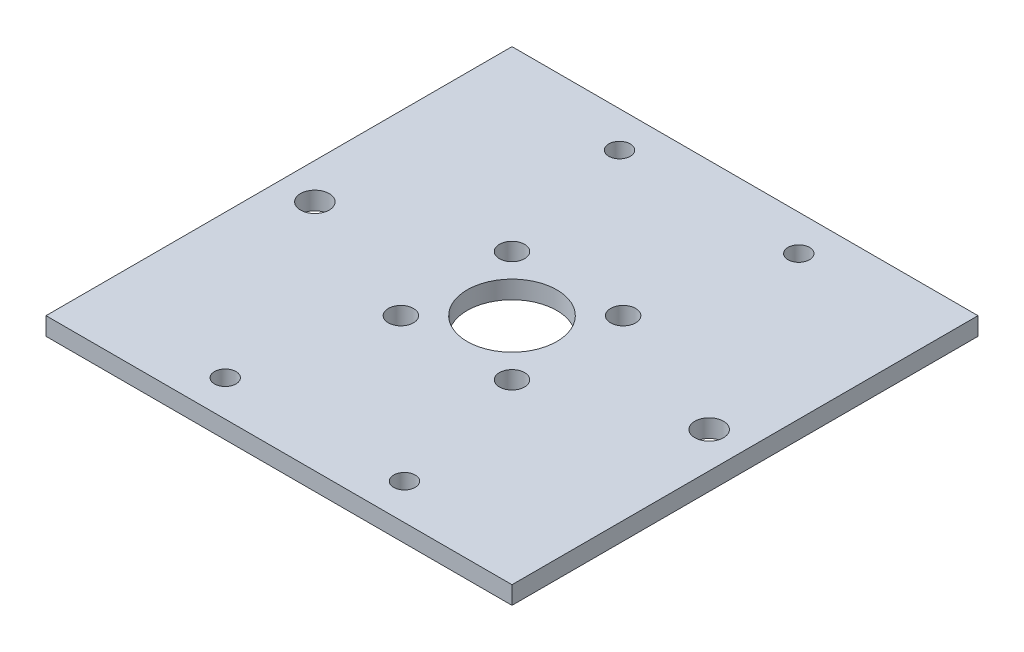
ISO-10303-21;
HEADER;
FILE_DESCRIPTION(('STEP AP214'),'2;1');
FILE_NAME('part.step','',(''),(''),'','','');
FILE_SCHEMA(('AUTOMOTIVE_DESIGN { 1 0 10303 214 1 1 1 1 }'));
ENDSEC;
DATA;
#1=APPLICATION_CONTEXT('core data for automotive mechanical design processes');
#2=APPLICATION_PROTOCOL_DEFINITION('international standard','automotive_design',2000,#1);
#3=PRODUCT_CONTEXT('',#1,'mechanical');
#4=PRODUCT('Part','Part','',(#3));
#5=PRODUCT_RELATED_PRODUCT_CATEGORY('part','',(#4));
#6=PRODUCT_DEFINITION_FORMATION('','',#4);
#7=PRODUCT_DEFINITION_CONTEXT('part definition',#1,'design');
#8=PRODUCT_DEFINITION('design','',#6,#7);
#9=PRODUCT_DEFINITION_SHAPE('','',#8);
#10=(LENGTH_UNIT() NAMED_UNIT(*) SI_UNIT(.MILLI.,.METRE.));
#11=(NAMED_UNIT(*) PLANE_ANGLE_UNIT() SI_UNIT($,.RADIAN.));
#12=(NAMED_UNIT(*) SI_UNIT($,.STERADIAN.) SOLID_ANGLE_UNIT());
#13=UNCERTAINTY_MEASURE_WITH_UNIT(LENGTH_MEASURE(1.E-05),#10,'distance_accuracy_value','');
#14=(GEOMETRIC_REPRESENTATION_CONTEXT(3) GLOBAL_UNCERTAINTY_ASSIGNED_CONTEXT((#13)) GLOBAL_UNIT_ASSIGNED_CONTEXT((#10,
#11,#12)) REPRESENTATION_CONTEXT('',''));
#15=CARTESIAN_POINT('',(0.,0.,0.));
#16=DIRECTION('',(0.,0.,1.));
#17=DIRECTION('',(1.,0.,0.));
#18=AXIS2_PLACEMENT_3D('',#15,#16,#17);
#19=CARTESIAN_POINT('',(65.,5.,0.));
#20=DIRECTION('',(1.,0.,0.));
#21=DIRECTION('',(0.,0.,-1.));
#22=AXIS2_PLACEMENT_3D('',#19,#20,#21);
#23=PLANE('',#22);
#24=DIRECTION('',(0.,0.,1.));
#25=VECTOR('',#24,1.);
#26=CARTESIAN_POINT('',(65.,0.,0.));
#27=LINE('',#26,#25);
#28=CARTESIAN_POINT('',(65.,0.,-65.));
#29=VERTEX_POINT('',#28);
#30=CARTESIAN_POINT('',(65.,0.,65.));
#31=VERTEX_POINT('',#30);
#32=EDGE_CURVE('E130',#29,#31,#27,.T.);
#33=ORIENTED_EDGE('',*,*,#32,.F.);
#34=DIRECTION('',(0.,-1.,0.));
#35=VECTOR('',#34,1.);
#36=CARTESIAN_POINT('',(65.,5.,-65.));
#37=LINE('',#36,#35);
#38=CARTESIAN_POINT('',(65.,5.,-65.));
#39=VERTEX_POINT('',#38);
#40=EDGE_CURVE('E11',#39,#29,#37,.T.);
#41=ORIENTED_EDGE('',*,*,#40,.F.);
#42=DIRECTION('',(0.,0.,1.));
#43=VECTOR('',#42,1.);
#44=CARTESIAN_POINT('',(65.,5.,0.));
#45=LINE('',#44,#43);
#46=CARTESIAN_POINT('',(65.,5.,65.));
#47=VERTEX_POINT('',#46);
#48=EDGE_CURVE('E108',#39,#47,#45,.T.);
#49=ORIENTED_EDGE('',*,*,#48,.T.);
#50=DIRECTION('',(0.,-1.,0.));
#51=VECTOR('',#50,1.);
#52=CARTESIAN_POINT('',(65.,5.,65.));
#53=LINE('',#52,#51);
#54=EDGE_CURVE('E83',#47,#31,#53,.T.);
#55=ORIENTED_EDGE('',*,*,#54,.T.);
#56=EDGE_LOOP('',(#33,#41,#49,#55));
#57=FACE_BOUND('',#56,.T.);
#58=ADVANCED_FACE('F40',(#57),#23,.T.);
#59=CARTESIAN_POINT('',(0.,5.,-65.));
#60=DIRECTION('',(0.,0.,-1.));
#61=DIRECTION('',(-1.,0.,0.));
#62=AXIS2_PLACEMENT_3D('',#59,#60,#61);
#63=PLANE('',#62);
#64=DIRECTION('',(1.,0.,0.));
#65=VECTOR('',#64,1.);
#66=CARTESIAN_POINT('',(0.,0.,-65.));
#67=LINE('',#66,#65);
#68=CARTESIAN_POINT('',(-65.,0.,-65.));
#69=VERTEX_POINT('',#68);
#70=EDGE_CURVE('E95',#69,#29,#67,.T.);
#71=ORIENTED_EDGE('',*,*,#70,.F.);
#72=DIRECTION('',(0.,-1.,0.));
#73=VECTOR('',#72,1.);
#74=CARTESIAN_POINT('',(-65.,5.,-65.));
#75=LINE('',#74,#73);
#76=CARTESIAN_POINT('',(-65.,5.,-65.));
#77=VERTEX_POINT('',#76);
#78=EDGE_CURVE('E51',#77,#69,#75,.T.);
#79=ORIENTED_EDGE('',*,*,#78,.F.);
#80=DIRECTION('',(1.,0.,0.));
#81=VECTOR('',#80,1.);
#82=CARTESIAN_POINT('',(0.,5.,-65.));
#83=LINE('',#82,#81);
#84=EDGE_CURVE('E93',#77,#39,#83,.T.);
#85=ORIENTED_EDGE('',*,*,#84,.T.);
#86=ORIENTED_EDGE('',*,*,#40,.T.);
#87=EDGE_LOOP('',(#71,#79,#85,#86));
#88=FACE_BOUND('',#87,.T.);
#89=ADVANCED_FACE('F91',(#88),#63,.T.);
#90=CARTESIAN_POINT('',(-65.,5.,0.));
#91=DIRECTION('',(1.,0.,0.));
#92=DIRECTION('',(0.,0.,-1.));
#93=AXIS2_PLACEMENT_3D('',#90,#91,#92);
#94=PLANE('',#93);
#95=DIRECTION('',(0.,0.,1.));
#96=VECTOR('',#95,1.);
#97=CARTESIAN_POINT('',(-65.,0.,0.));
#98=LINE('',#97,#96);
#99=CARTESIAN_POINT('',(-65.,0.,65.));
#100=VERTEX_POINT('',#99);
#101=EDGE_CURVE('E135',#69,#100,#98,.T.);
#102=ORIENTED_EDGE('',*,*,#101,.T.);
#103=DIRECTION('',(0.,-1.,0.));
#104=VECTOR('',#103,1.);
#105=CARTESIAN_POINT('',(-65.,5.,65.));
#106=LINE('',#105,#104);
#107=CARTESIAN_POINT('',(-65.,5.,65.));
#108=VERTEX_POINT('',#107);
#109=EDGE_CURVE('E99',#108,#100,#106,.T.);
#110=ORIENTED_EDGE('',*,*,#109,.F.);
#111=DIRECTION('',(0.,0.,1.));
#112=VECTOR('',#111,1.);
#113=CARTESIAN_POINT('',(-65.,5.,0.));
#114=LINE('',#113,#112);
#115=EDGE_CURVE('E102',#77,#108,#114,.T.);
#116=ORIENTED_EDGE('',*,*,#115,.F.);
#117=ORIENTED_EDGE('',*,*,#78,.T.);
#118=EDGE_LOOP('',(#102,#110,#116,#117));
#119=FACE_BOUND('',#118,.T.);
#120=ADVANCED_FACE('F103',(#119),#94,.F.);
#121=CARTESIAN_POINT('',(-55.,5.,0.));
#122=DIRECTION('',(0.,-1.,0.));
#123=DIRECTION('',(0.,0.,-1.));
#124=AXIS2_PLACEMENT_3D('',#121,#122,#123);
#125=CYLINDRICAL_SURFACE('',#124,4.00000000000001);
#126=CARTESIAN_POINT('',(-55.,5.,0.));
#127=DIRECTION('',(0.,1.,0.));
#128=DIRECTION('',(0.,0.,1.));
#129=AXIS2_PLACEMENT_3D('',#126,#127,#128);
#130=CIRCLE('',#129,4.00000000000001);
#131=CARTESIAN_POINT('',(-55.,5.,4.00000000000001));
#132=VERTEX_POINT('',#131);
#133=EDGE_CURVE('E118',#132,#132,#130,.T.);
#134=ORIENTED_EDGE('',*,*,#133,.T.);
#135=EDGE_LOOP('',(#134));
#136=FACE_BOUND('',#135,.T.);
#137=CARTESIAN_POINT('',(-55.,0.,0.));
#138=DIRECTION('',(0.,1.,0.));
#139=DIRECTION('',(0.,0.,1.));
#140=AXIS2_PLACEMENT_3D('',#137,#138,#139);
#141=CIRCLE('',#140,4.00000000000001);
#142=CARTESIAN_POINT('',(-55.,0.,4.00000000000001));
#143=VERTEX_POINT('',#142);
#144=EDGE_CURVE('E140',#143,#143,#141,.T.);
#145=ORIENTED_EDGE('',*,*,#144,.F.);
#146=EDGE_LOOP('',(#145));
#147=FACE_BOUND('',#146,.T.);
#148=ADVANCED_FACE('F197',(#136,#147),#125,.F.);
#149=CARTESIAN_POINT('',(0.,5.,65.));
#150=DIRECTION('',(0.,0.,-1.));
#151=DIRECTION('',(-1.,0.,0.));
#152=AXIS2_PLACEMENT_3D('',#149,#150,#151);
#153=PLANE('',#152);
#154=DIRECTION('',(1.,0.,0.));
#155=VECTOR('',#154,1.);
#156=CARTESIAN_POINT('',(0.,0.,65.));
#157=LINE('',#156,#155);
#158=EDGE_CURVE('E76',#100,#31,#157,.T.);
#159=ORIENTED_EDGE('',*,*,#158,.T.);
#160=ORIENTED_EDGE('',*,*,#54,.F.);
#161=DIRECTION('',(1.,0.,0.));
#162=VECTOR('',#161,1.);
#163=CARTESIAN_POINT('',(0.,5.,65.));
#164=LINE('',#163,#162);
#165=EDGE_CURVE('E60',#108,#47,#164,.T.);
#166=ORIENTED_EDGE('',*,*,#165,.F.);
#167=ORIENTED_EDGE('',*,*,#109,.T.);
#168=EDGE_LOOP('',(#159,#160,#166,#167));
#169=FACE_BOUND('',#168,.T.);
#170=ADVANCED_FACE('F198',(#169),#153,.F.);
#171=CARTESIAN_POINT('',(0.,5.,0.));
#172=DIRECTION('',(0.,-1.,0.));
#173=DIRECTION('',(0.,0.,-1.));
#174=AXIS2_PLACEMENT_3D('',#171,#172,#173);
#175=CYLINDRICAL_SURFACE('',#174,12.5);
#176=CARTESIAN_POINT('',(0.,5.,0.));
#177=DIRECTION('',(0.,1.,0.));
#178=DIRECTION('',(0.,0.,1.));
#179=AXIS2_PLACEMENT_3D('',#176,#177,#178);
#180=CIRCLE('',#179,12.5);
#181=CARTESIAN_POINT('',(0.,5.,12.5));
#182=VERTEX_POINT('',#181);
#183=EDGE_CURVE('E112',#182,#182,#180,.T.);
#184=ORIENTED_EDGE('',*,*,#183,.T.);
#185=EDGE_LOOP('',(#184));
#186=FACE_BOUND('',#185,.T.);
#187=CARTESIAN_POINT('',(0.,0.,0.));
#188=DIRECTION('',(0.,1.,0.));
#189=DIRECTION('',(0.,0.,1.));
#190=AXIS2_PLACEMENT_3D('',#187,#188,#189);
#191=CIRCLE('',#190,12.5);
#192=CARTESIAN_POINT('',(0.,0.,12.5));
#193=VERTEX_POINT('',#192);
#194=EDGE_CURVE('E126',#193,#193,#191,.T.);
#195=ORIENTED_EDGE('',*,*,#194,.F.);
#196=EDGE_LOOP('',(#195));
#197=FACE_BOUND('',#196,.T.);
#198=ADVANCED_FACE('F42',(#186,#197),#175,.F.);
#199=CARTESIAN_POINT('',(55.,5.,0.));
#200=DIRECTION('',(0.,-1.,0.));
#201=DIRECTION('',(0.,0.,-1.));
#202=AXIS2_PLACEMENT_3D('',#199,#200,#201);
#203=CYLINDRICAL_SURFACE('',#202,4.00000000000001);
#204=CARTESIAN_POINT('',(55.,5.,0.));
#205=DIRECTION('',(0.,1.,0.));
#206=DIRECTION('',(0.,0.,1.));
#207=AXIS2_PLACEMENT_3D('',#204,#205,#206);
#208=CIRCLE('',#207,4.00000000000001);
#209=CARTESIAN_POINT('',(55.,5.,4.00000000000001));
#210=VERTEX_POINT('',#209);
#211=EDGE_CURVE('E122',#210,#210,#208,.F.);
#212=ORIENTED_EDGE('',*,*,#211,.F.);
#213=EDGE_LOOP('',(#212));
#214=FACE_BOUND('',#213,.T.);
#215=CARTESIAN_POINT('',(55.,0.,0.));
#216=DIRECTION('',(0.,1.,0.));
#217=DIRECTION('',(0.,0.,1.));
#218=AXIS2_PLACEMENT_3D('',#215,#216,#217);
#219=CIRCLE('',#218,4.00000000000001);
#220=CARTESIAN_POINT('',(55.,0.,4.00000000000001));
#221=VERTEX_POINT('',#220);
#222=EDGE_CURVE('E144',#221,#221,#219,.F.);
#223=ORIENTED_EDGE('',*,*,#222,.T.);
#224=EDGE_LOOP('',(#223));
#225=FACE_BOUND('',#224,.T.);
#226=ADVANCED_FACE('F205',(#214,#225),#203,.F.);
#227=CARTESIAN_POINT('',(0.,5.,0.));
#228=DIRECTION('',(0.,1.,0.));
#229=DIRECTION('',(0.,0.,1.));
#230=AXIS2_PLACEMENT_3D('',#227,#228,#229);
#231=PLANE('',#230);
#232=CARTESIAN_POINT('',(15.5,5.,-15.5));
#233=DIRECTION('',(0.,1.,0.));
#234=DIRECTION('',(0.,0.,1.));
#235=AXIS2_PLACEMENT_3D('',#232,#233,#234);
#236=CIRCLE('',#235,3.5);
#237=CARTESIAN_POINT('',(15.5,5.,-12.));
#238=VERTEX_POINT('',#237);
#239=EDGE_CURVE('E272',#238,#238,#236,.T.);
#240=ORIENTED_EDGE('',*,*,#239,.F.);
#241=EDGE_LOOP('',(#240));
#242=FACE_BOUND('',#241,.T.);
#243=CARTESIAN_POINT('',(-15.5,5.,15.5));
#244=DIRECTION('',(0.,1.,0.));
#245=DIRECTION('',(0.,0.,1.));
#246=AXIS2_PLACEMENT_3D('',#243,#244,#245);
#247=CIRCLE('',#246,3.5);
#248=CARTESIAN_POINT('',(-15.5,5.,19.));
#249=VERTEX_POINT('',#248);
#250=EDGE_CURVE('E273',#249,#249,#247,.T.);
#251=ORIENTED_EDGE('',*,*,#250,.F.);
#252=EDGE_LOOP('',(#251));
#253=FACE_BOUND('',#252,.T.);
#254=CARTESIAN_POINT('',(15.5,5.,15.5));
#255=DIRECTION('',(0.,1.,0.));
#256=DIRECTION('',(0.,0.,1.));
#257=AXIS2_PLACEMENT_3D('',#254,#255,#256);
#258=CIRCLE('',#257,3.5);
#259=CARTESIAN_POINT('',(15.5,5.,19.));
#260=VERTEX_POINT('',#259);
#261=EDGE_CURVE('E287',#260,#260,#258,.T.);
#262=ORIENTED_EDGE('',*,*,#261,.F.);
#263=EDGE_LOOP('',(#262));
#264=FACE_BOUND('',#263,.T.);
#265=CARTESIAN_POINT('',(-15.5,5.,-15.5));
#266=DIRECTION('',(0.,1.,0.));
#267=DIRECTION('',(0.,0.,1.));
#268=AXIS2_PLACEMENT_3D('',#265,#266,#267);
#269=CIRCLE('',#268,3.5);
#270=CARTESIAN_POINT('',(-15.5,5.,-12.));
#271=VERTEX_POINT('',#270);
#272=EDGE_CURVE('E263',#271,#271,#269,.T.);
#273=ORIENTED_EDGE('',*,*,#272,.F.);
#274=EDGE_LOOP('',(#273));
#275=FACE_BOUND('',#274,.T.);
#276=CARTESIAN_POINT('',(-25.,5.,55.));
#277=DIRECTION('',(0.,1.,0.));
#278=DIRECTION('',(0.,0.,-1.));
#279=AXIS2_PLACEMENT_3D('',#276,#277,#278);
#280=CIRCLE('',#279,3.);
#281=CARTESIAN_POINT('',(-25.,5.,52.));
#282=VERTEX_POINT('',#281);
#283=EDGE_CURVE('E249',#282,#282,#280,.T.);
#284=ORIENTED_EDGE('',*,*,#283,.F.);
#285=EDGE_LOOP('',(#284));
#286=FACE_BOUND('',#285,.T.);
#287=CARTESIAN_POINT('',(25.,5.,55.));
#288=DIRECTION('',(0.,1.,0.));
#289=DIRECTION('',(0.,0.,1.));
#290=AXIS2_PLACEMENT_3D('',#287,#288,#289);
#291=CIRCLE('',#290,3.);
#292=CARTESIAN_POINT('',(25.,5.,58.));
#293=VERTEX_POINT('',#292);
#294=EDGE_CURVE('E252',#293,#293,#291,.T.);
#295=ORIENTED_EDGE('',*,*,#294,.F.);
#296=EDGE_LOOP('',(#295));
#297=FACE_BOUND('',#296,.T.);
#298=CARTESIAN_POINT('',(25.,5.,-55.));
#299=DIRECTION('',(0.,1.,0.));
#300=DIRECTION('',(0.,0.,-1.));
#301=AXIS2_PLACEMENT_3D('',#298,#299,#300);
#302=CIRCLE('',#301,3.);
#303=CARTESIAN_POINT('',(25.,5.,-58.));
#304=VERTEX_POINT('',#303);
#305=EDGE_CURVE('E248',#304,#304,#302,.T.);
#306=ORIENTED_EDGE('',*,*,#305,.F.);
#307=EDGE_LOOP('',(#306));
#308=FACE_BOUND('',#307,.T.);
#309=CARTESIAN_POINT('',(-25.,5.,-55.));
#310=DIRECTION('',(0.,1.,0.));
#311=DIRECTION('',(0.,0.,1.));
#312=AXIS2_PLACEMENT_3D('',#309,#310,#311);
#313=CIRCLE('',#312,3.);
#314=CARTESIAN_POINT('',(-25.,5.,-52.));
#315=VERTEX_POINT('',#314);
#316=EDGE_CURVE('E157',#315,#315,#313,.T.);
#317=ORIENTED_EDGE('',*,*,#316,.F.);
#318=EDGE_LOOP('',(#317));
#319=FACE_BOUND('',#318,.T.);
#320=ORIENTED_EDGE('',*,*,#183,.F.);
#321=EDGE_LOOP('',(#320));
#322=FACE_BOUND('',#321,.T.);
#323=ORIENTED_EDGE('',*,*,#48,.F.);
#324=ORIENTED_EDGE('',*,*,#84,.F.);
#325=ORIENTED_EDGE('',*,*,#115,.T.);
#326=ORIENTED_EDGE('',*,*,#165,.T.);
#327=EDGE_LOOP('',(#323,#324,#325,#326));
#328=FACE_BOUND('',#327,.T.);
#329=ORIENTED_EDGE('',*,*,#133,.F.);
#330=EDGE_LOOP('',(#329));
#331=FACE_BOUND('',#330,.T.);
#332=ORIENTED_EDGE('',*,*,#211,.T.);
#333=EDGE_LOOP('',(#332));
#334=FACE_BOUND('',#333,.T.);
#335=ADVANCED_FACE('F106',(#242,#253,#264,#275,#286,#297,#308,#319,#322,#328,#331,#334),#231,.T.);
#336=CARTESIAN_POINT('',(0.,0.,0.));
#337=DIRECTION('',(0.,1.,0.));
#338=DIRECTION('',(0.,0.,1.));
#339=AXIS2_PLACEMENT_3D('',#336,#337,#338);
#340=PLANE('',#339);
#341=CARTESIAN_POINT('',(15.5,0.,-15.5));
#342=DIRECTION('',(0.,1.,0.));
#343=DIRECTION('',(0.,0.,1.));
#344=AXIS2_PLACEMENT_3D('',#341,#342,#343);
#345=CIRCLE('',#344,3.5);
#346=CARTESIAN_POINT('',(15.5,0.,-12.));
#347=VERTEX_POINT('',#346);
#348=EDGE_CURVE('E267',#347,#347,#345,.F.);
#349=ORIENTED_EDGE('',*,*,#348,.F.);
#350=EDGE_LOOP('',(#349));
#351=FACE_BOUND('',#350,.T.);
#352=CARTESIAN_POINT('',(-15.5,0.,15.5));
#353=DIRECTION('',(0.,1.,0.));
#354=DIRECTION('',(0.,0.,1.));
#355=AXIS2_PLACEMENT_3D('',#352,#353,#354);
#356=CIRCLE('',#355,3.5);
#357=CARTESIAN_POINT('',(-15.5,0.,19.));
#358=VERTEX_POINT('',#357);
#359=EDGE_CURVE('E268',#358,#358,#356,.F.);
#360=ORIENTED_EDGE('',*,*,#359,.F.);
#361=EDGE_LOOP('',(#360));
#362=FACE_BOUND('',#361,.T.);
#363=CARTESIAN_POINT('',(15.5,0.,15.5));
#364=DIRECTION('',(0.,1.,0.));
#365=DIRECTION('',(0.,0.,1.));
#366=AXIS2_PLACEMENT_3D('',#363,#364,#365);
#367=CIRCLE('',#366,3.5);
#368=CARTESIAN_POINT('',(15.5,0.,19.));
#369=VERTEX_POINT('',#368);
#370=EDGE_CURVE('E277',#369,#369,#367,.F.);
#371=ORIENTED_EDGE('',*,*,#370,.F.);
#372=EDGE_LOOP('',(#371));
#373=FACE_BOUND('',#372,.T.);
#374=CARTESIAN_POINT('',(-15.5,0.,-15.5));
#375=DIRECTION('',(0.,1.,0.));
#376=DIRECTION('',(0.,0.,1.));
#377=AXIS2_PLACEMENT_3D('',#374,#375,#376);
#378=CIRCLE('',#377,3.5);
#379=CARTESIAN_POINT('',(-15.5,0.,-12.));
#380=VERTEX_POINT('',#379);
#381=EDGE_CURVE('E253',#380,#380,#378,.F.);
#382=ORIENTED_EDGE('',*,*,#381,.F.);
#383=EDGE_LOOP('',(#382));
#384=FACE_BOUND('',#383,.T.);
#385=CARTESIAN_POINT('',(-25.,0.,55.));
#386=DIRECTION('',(0.,1.,0.));
#387=DIRECTION('',(0.,0.,1.));
#388=AXIS2_PLACEMENT_3D('',#385,#386,#387);
#389=CIRCLE('',#388,3.);
#390=CARTESIAN_POINT('',(-25.,0.,58.));
#391=VERTEX_POINT('',#390);
#392=EDGE_CURVE('E44',#391,#391,#389,.T.);
#393=ORIENTED_EDGE('',*,*,#392,.T.);
#394=EDGE_LOOP('',(#393));
#395=FACE_BOUND('',#394,.T.);
#396=CARTESIAN_POINT('',(25.,0.,55.));
#397=DIRECTION('',(0.,1.,0.));
#398=DIRECTION('',(0.,0.,1.));
#399=AXIS2_PLACEMENT_3D('',#396,#397,#398);
#400=CIRCLE('',#399,3.);
#401=CARTESIAN_POINT('',(25.,0.,58.));
#402=VERTEX_POINT('',#401);
#403=EDGE_CURVE('E160',#402,#402,#400,.T.);
#404=ORIENTED_EDGE('',*,*,#403,.T.);
#405=EDGE_LOOP('',(#404));
#406=FACE_BOUND('',#405,.T.);
#407=CARTESIAN_POINT('',(25.,0.,-55.));
#408=DIRECTION('',(0.,1.,0.));
#409=DIRECTION('',(0.,0.,1.));
#410=AXIS2_PLACEMENT_3D('',#407,#408,#409);
#411=CIRCLE('',#410,3.);
#412=CARTESIAN_POINT('',(25.,0.,-52.));
#413=VERTEX_POINT('',#412);
#414=EDGE_CURVE('E156',#413,#413,#411,.T.);
#415=ORIENTED_EDGE('',*,*,#414,.T.);
#416=EDGE_LOOP('',(#415));
#417=FACE_BOUND('',#416,.T.);
#418=CARTESIAN_POINT('',(-25.,0.,-55.));
#419=DIRECTION('',(0.,1.,0.));
#420=DIRECTION('',(0.,0.,1.));
#421=AXIS2_PLACEMENT_3D('',#418,#419,#420);
#422=CIRCLE('',#421,3.);
#423=CARTESIAN_POINT('',(-25.,0.,-52.));
#424=VERTEX_POINT('',#423);
#425=EDGE_CURVE('E152',#424,#424,#422,.T.);
#426=ORIENTED_EDGE('',*,*,#425,.T.);
#427=EDGE_LOOP('',(#426));
#428=FACE_BOUND('',#427,.T.);
#429=ORIENTED_EDGE('',*,*,#194,.T.);
#430=EDGE_LOOP('',(#429));
#431=FACE_BOUND('',#430,.T.);
#432=ORIENTED_EDGE('',*,*,#32,.T.);
#433=ORIENTED_EDGE('',*,*,#158,.F.);
#434=ORIENTED_EDGE('',*,*,#101,.F.);
#435=ORIENTED_EDGE('',*,*,#70,.T.);
#436=EDGE_LOOP('',(#432,#433,#434,#435));
#437=FACE_BOUND('',#436,.T.);
#438=ORIENTED_EDGE('',*,*,#144,.T.);
#439=EDGE_LOOP('',(#438));
#440=FACE_BOUND('',#439,.T.);
#441=ORIENTED_EDGE('',*,*,#222,.F.);
#442=EDGE_LOOP('',(#441));
#443=FACE_BOUND('',#442,.T.);
#444=ADVANCED_FACE('F169',(#351,#362,#373,#384,#395,#406,#417,#428,#431,#437,#440,#443),#340,.F.);
#445=CARTESIAN_POINT('',(-25.,-5.,-55.));
#446=DIRECTION('',(0.,1.,0.));
#447=DIRECTION('',(0.,0.,1.));
#448=AXIS2_PLACEMENT_3D('',#445,#446,#447);
#449=CYLINDRICAL_SURFACE('',#448,3.);
#450=ORIENTED_EDGE('',*,*,#316,.T.);
#451=EDGE_LOOP('',(#450));
#452=FACE_BOUND('',#451,.T.);
#453=ORIENTED_EDGE('',*,*,#425,.F.);
#454=EDGE_LOOP('',(#453));
#455=FACE_BOUND('',#454,.T.);
#456=ADVANCED_FACE('F211',(#452,#455),#449,.F.);
#457=CARTESIAN_POINT('',(25.,-5.,-55.));
#458=DIRECTION('',(0.,1.,0.));
#459=DIRECTION('',(0.,0.,1.));
#460=AXIS2_PLACEMENT_3D('',#457,#458,#459);
#461=CYLINDRICAL_SURFACE('',#460,3.);
#462=ORIENTED_EDGE('',*,*,#305,.T.);
#463=EDGE_LOOP('',(#462));
#464=FACE_BOUND('',#463,.T.);
#465=ORIENTED_EDGE('',*,*,#414,.F.);
#466=EDGE_LOOP('',(#465));
#467=FACE_BOUND('',#466,.T.);
#468=ADVANCED_FACE('F184',(#464,#467),#461,.F.);
#469=CARTESIAN_POINT('',(25.,-5.,55.));
#470=DIRECTION('',(0.,1.,0.));
#471=DIRECTION('',(0.,0.,1.));
#472=AXIS2_PLACEMENT_3D('',#469,#470,#471);
#473=CYLINDRICAL_SURFACE('',#472,3.);
#474=ORIENTED_EDGE('',*,*,#294,.T.);
#475=EDGE_LOOP('',(#474));
#476=FACE_BOUND('',#475,.T.);
#477=ORIENTED_EDGE('',*,*,#403,.F.);
#478=EDGE_LOOP('',(#477));
#479=FACE_BOUND('',#478,.T.);
#480=ADVANCED_FACE('F174',(#476,#479),#473,.F.);
#481=CARTESIAN_POINT('',(-25.,-5.,55.));
#482=DIRECTION('',(0.,1.,0.));
#483=DIRECTION('',(0.,0.,1.));
#484=AXIS2_PLACEMENT_3D('',#481,#482,#483);
#485=CYLINDRICAL_SURFACE('',#484,3.);
#486=ORIENTED_EDGE('',*,*,#283,.T.);
#487=EDGE_LOOP('',(#486));
#488=FACE_BOUND('',#487,.T.);
#489=ORIENTED_EDGE('',*,*,#392,.F.);
#490=EDGE_LOOP('',(#489));
#491=FACE_BOUND('',#490,.T.);
#492=ADVANCED_FACE('F171',(#488,#491),#485,.F.);
#493=CARTESIAN_POINT('',(-15.5,-9.89949493661167,-15.5));
#494=DIRECTION('',(0.,1.,0.));
#495=DIRECTION('',(0.,0.,1.));
#496=AXIS2_PLACEMENT_3D('',#493,#494,#495);
#497=CYLINDRICAL_SURFACE('',#496,3.5);
#498=ORIENTED_EDGE('',*,*,#381,.T.);
#499=EDGE_LOOP('',(#498));
#500=FACE_BOUND('',#499,.T.);
#501=ORIENTED_EDGE('',*,*,#272,.T.);
#502=EDGE_LOOP('',(#501));
#503=FACE_BOUND('',#502,.T.);
#504=ADVANCED_FACE('F173',(#500,#503),#497,.F.);
#505=CARTESIAN_POINT('',(15.5,-9.89949493661167,15.5));
#506=DIRECTION('',(0.,1.,0.));
#507=DIRECTION('',(0.,0.,1.));
#508=AXIS2_PLACEMENT_3D('',#505,#506,#507);
#509=CYLINDRICAL_SURFACE('',#508,3.5);
#510=ORIENTED_EDGE('',*,*,#370,.T.);
#511=EDGE_LOOP('',(#510));
#512=FACE_BOUND('',#511,.T.);
#513=ORIENTED_EDGE('',*,*,#261,.T.);
#514=EDGE_LOOP('',(#513));
#515=FACE_BOUND('',#514,.T.);
#516=ADVANCED_FACE('F181',(#512,#515),#509,.F.);
#517=CARTESIAN_POINT('',(-15.5,-9.89949493661167,15.5));
#518=DIRECTION('',(0.,1.,0.));
#519=DIRECTION('',(0.,0.,1.));
#520=AXIS2_PLACEMENT_3D('',#517,#518,#519);
#521=CYLINDRICAL_SURFACE('',#520,3.5);
#522=ORIENTED_EDGE('',*,*,#359,.T.);
#523=EDGE_LOOP('',(#522));
#524=FACE_BOUND('',#523,.T.);
#525=ORIENTED_EDGE('',*,*,#250,.T.);
#526=EDGE_LOOP('',(#525));
#527=FACE_BOUND('',#526,.T.);
#528=ADVANCED_FACE('F308',(#524,#527),#521,.F.);
#529=CARTESIAN_POINT('',(15.5,-9.89949493661167,-15.5));
#530=DIRECTION('',(0.,1.,0.));
#531=DIRECTION('',(0.,0.,1.));
#532=AXIS2_PLACEMENT_3D('',#529,#530,#531);
#533=CYLINDRICAL_SURFACE('',#532,3.5);
#534=ORIENTED_EDGE('',*,*,#348,.T.);
#535=EDGE_LOOP('',(#534));
#536=FACE_BOUND('',#535,.T.);
#537=ORIENTED_EDGE('',*,*,#239,.T.);
#538=EDGE_LOOP('',(#537));
#539=FACE_BOUND('',#538,.T.);
#540=ADVANCED_FACE('F314',(#536,#539),#533,.F.);
#541=CLOSED_SHELL('',(#58,#89,#120,#148,#170,#198,#226,#335,#444,#456,#468,#480,#492,#504,#516,
#528,#540));
#542=MANIFOLD_SOLID_BREP('B2',#541);
#543=ADVANCED_BREP_SHAPE_REPRESENTATION('',(#18,#542),#14);
#544=SHAPE_DEFINITION_REPRESENTATION(#9,#543);
ENDSEC;
END-ISO-10303-21;
